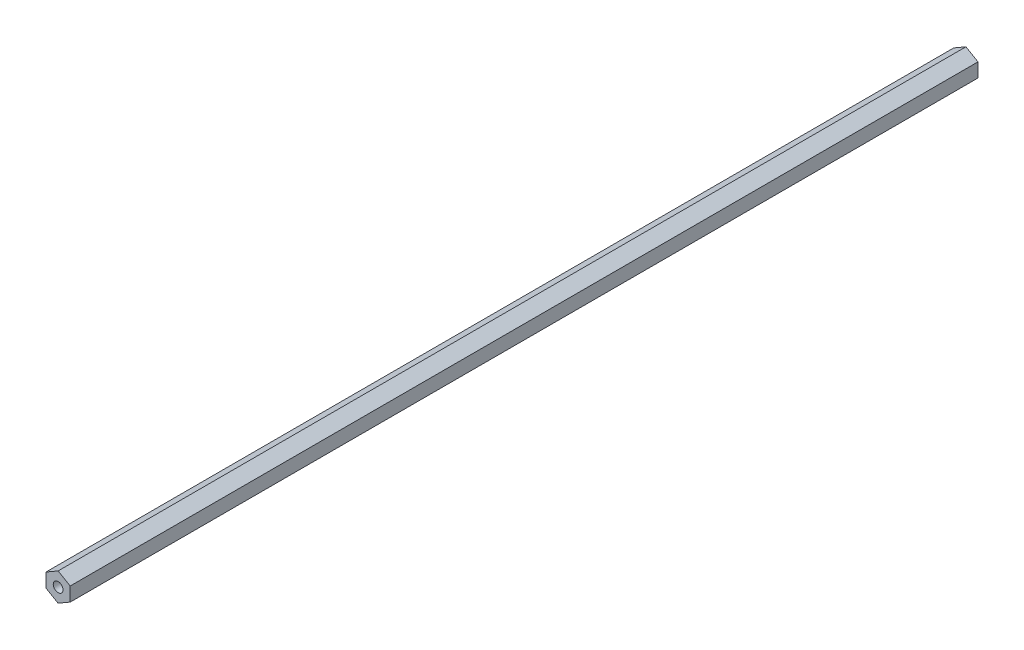
ISO-10303-21;
HEADER;
FILE_DESCRIPTION(('STEP AP214'),'2;1');
FILE_NAME('part.step','',(''),(''),'','','');
FILE_SCHEMA(('AUTOMOTIVE_DESIGN { 1 0 10303 214 1 1 1 1 }'));
ENDSEC;
DATA;
#1=APPLICATION_CONTEXT('core data for automotive mechanical design processes');
#2=APPLICATION_PROTOCOL_DEFINITION('international standard','automotive_design',2000,#1);
#3=PRODUCT_CONTEXT('',#1,'mechanical');
#4=PRODUCT('Part','Part','',(#3));
#5=PRODUCT_RELATED_PRODUCT_CATEGORY('part','',(#4));
#6=PRODUCT_DEFINITION_FORMATION('','',#4);
#7=PRODUCT_DEFINITION_CONTEXT('part definition',#1,'design');
#8=PRODUCT_DEFINITION('design','',#6,#7);
#9=PRODUCT_DEFINITION_SHAPE('','',#8);
#10=(LENGTH_UNIT() NAMED_UNIT(*) SI_UNIT(.MILLI.,.METRE.));
#11=(NAMED_UNIT(*) PLANE_ANGLE_UNIT() SI_UNIT($,.RADIAN.));
#12=(NAMED_UNIT(*) SI_UNIT($,.STERADIAN.) SOLID_ANGLE_UNIT());
#13=UNCERTAINTY_MEASURE_WITH_UNIT(LENGTH_MEASURE(1.E-05),#10,'distance_accuracy_value','');
#14=(GEOMETRIC_REPRESENTATION_CONTEXT(3) GLOBAL_UNCERTAINTY_ASSIGNED_CONTEXT((#13)) GLOBAL_UNIT_ASSIGNED_CONTEXT((#10,
#11,#12)) REPRESENTATION_CONTEXT('',''));
#15=CARTESIAN_POINT('',(0.,0.,0.));
#16=DIRECTION('',(0.,0.,1.));
#17=DIRECTION('',(1.,0.,0.));
#18=AXIS2_PLACEMENT_3D('',#15,#16,#17);
#19=CARTESIAN_POINT('',(-6.35,3.66617420935412,238.125));
#20=DIRECTION('',(0.5,-0.866025403784439,0.));
#21=DIRECTION('',(0.866025403784439,0.5,0.));
#22=AXIS2_PLACEMENT_3D('',#19,#20,#21);
#23=PLANE('',#22);
#24=DIRECTION('',(-0.866025403784439,-0.5,0.));
#25=VECTOR('',#24,1.);
#26=CARTESIAN_POINT('',(-6.35,3.66617420935412,-238.125));
#27=LINE('',#26,#25);
#28=CARTESIAN_POINT('',(0.,7.33234841870825,-238.125));
#29=VERTEX_POINT('',#28);
#30=CARTESIAN_POINT('',(-6.35,3.66617420935412,-238.125));
#31=VERTEX_POINT('',#30);
#32=EDGE_CURVE('E136',#29,#31,#27,.T.);
#33=ORIENTED_EDGE('',*,*,#32,.T.);
#34=DIRECTION('',(0.,0.,-1.));
#35=VECTOR('',#34,1.);
#36=CARTESIAN_POINT('',(-6.35,3.66617420935412,238.125));
#37=LINE('',#36,#35);
#38=CARTESIAN_POINT('',(-6.35,3.66617420935412,238.125));
#39=VERTEX_POINT('',#38);
#40=EDGE_CURVE('E11',#39,#31,#37,.T.);
#41=ORIENTED_EDGE('',*,*,#40,.F.);
#42=DIRECTION('',(-0.866025403784439,-0.5,0.));
#43=VECTOR('',#42,1.);
#44=CARTESIAN_POINT('',(-6.35,3.66617420935412,238.125));
#45=LINE('',#44,#43);
#46=CARTESIAN_POINT('',(0.,7.33234841870825,238.125));
#47=VERTEX_POINT('',#46);
#48=EDGE_CURVE('E153',#47,#39,#45,.T.);
#49=ORIENTED_EDGE('',*,*,#48,.F.);
#50=DIRECTION('',(0.,0.,-1.));
#51=VECTOR('',#50,1.);
#52=CARTESIAN_POINT('',(0.,7.33234841870825,238.125));
#53=LINE('',#52,#51);
#54=EDGE_CURVE('E132',#47,#29,#53,.T.);
#55=ORIENTED_EDGE('',*,*,#54,.T.);
#56=EDGE_LOOP('',(#33,#41,#49,#55));
#57=FACE_BOUND('',#56,.T.);
#58=ADVANCED_FACE('F43',(#57),#23,.F.);
#59=CARTESIAN_POINT('',(-6.35,-3.66617420935412,238.125));
#60=DIRECTION('',(1.,0.,0.));
#61=DIRECTION('',(0.,1.,0.));
#62=AXIS2_PLACEMENT_3D('',#59,#60,#61);
#63=PLANE('',#62);
#64=DIRECTION('',(0.,-1.,0.));
#65=VECTOR('',#64,1.);
#66=CARTESIAN_POINT('',(-6.35,-3.66617420935412,-238.125));
#67=LINE('',#66,#65);
#68=CARTESIAN_POINT('',(-6.35,-3.66617420935412,-238.125));
#69=VERTEX_POINT('',#68);
#70=EDGE_CURVE('E140',#31,#69,#67,.T.);
#71=ORIENTED_EDGE('',*,*,#70,.T.);
#72=DIRECTION('',(0.,0.,-1.));
#73=VECTOR('',#72,1.);
#74=CARTESIAN_POINT('',(-6.35,-3.66617420935412,238.125));
#75=LINE('',#74,#73);
#76=CARTESIAN_POINT('',(-6.35,-3.66617420935412,238.125));
#77=VERTEX_POINT('',#76);
#78=EDGE_CURVE('E52',#77,#69,#75,.T.);
#79=ORIENTED_EDGE('',*,*,#78,.F.);
#80=DIRECTION('',(0.,-1.,0.));
#81=VECTOR('',#80,1.);
#82=CARTESIAN_POINT('',(-6.35,-3.66617420935412,238.125));
#83=LINE('',#82,#81);
#84=EDGE_CURVE('E98',#39,#77,#83,.T.);
#85=ORIENTED_EDGE('',*,*,#84,.F.);
#86=ORIENTED_EDGE('',*,*,#40,.T.);
#87=EDGE_LOOP('',(#71,#79,#85,#86));
#88=FACE_BOUND('',#87,.T.);
#89=ADVANCED_FACE('F183',(#88),#63,.F.);
#90=CARTESIAN_POINT('',(0.,-7.33234841870825,238.125));
#91=DIRECTION('',(0.5,0.866025403784439,0.));
#92=DIRECTION('',(-0.866025403784439,0.5,0.));
#93=AXIS2_PLACEMENT_3D('',#90,#91,#92);
#94=PLANE('',#93);
#95=DIRECTION('',(0.866025403784438,-0.5,0.));
#96=VECTOR('',#95,1.);
#97=CARTESIAN_POINT('',(0.,-7.33234841870825,-238.125));
#98=LINE('',#97,#96);
#99=CARTESIAN_POINT('',(0.,-7.33234841870825,-238.125));
#100=VERTEX_POINT('',#99);
#101=EDGE_CURVE('E144',#69,#100,#98,.T.);
#102=ORIENTED_EDGE('',*,*,#101,.T.);
#103=DIRECTION('',(0.,0.,-1.));
#104=VECTOR('',#103,1.);
#105=CARTESIAN_POINT('',(0.,-7.33234841870825,238.125));
#106=LINE('',#105,#104);
#107=CARTESIAN_POINT('',(0.,-7.33234841870825,238.125));
#108=VERTEX_POINT('',#107);
#109=EDGE_CURVE('E124',#108,#100,#106,.T.);
#110=ORIENTED_EDGE('',*,*,#109,.F.);
#111=DIRECTION('',(0.866025403784438,-0.5,0.));
#112=VECTOR('',#111,1.);
#113=CARTESIAN_POINT('',(0.,-7.33234841870825,238.125));
#114=LINE('',#113,#112);
#115=EDGE_CURVE('E113',#77,#108,#114,.T.);
#116=ORIENTED_EDGE('',*,*,#115,.F.);
#117=ORIENTED_EDGE('',*,*,#78,.T.);
#118=EDGE_LOOP('',(#102,#110,#116,#117));
#119=FACE_BOUND('',#118,.T.);
#120=ADVANCED_FACE('F164',(#119),#94,.F.);
#121=CARTESIAN_POINT('',(6.35,-3.66617420935412,238.125));
#122=DIRECTION('',(-0.5,0.866025403784438,0.));
#123=DIRECTION('',(-0.866025403784439,-0.5,0.));
#124=AXIS2_PLACEMENT_3D('',#121,#122,#123);
#125=PLANE('',#124);
#126=DIRECTION('',(0.866025403784439,0.5,0.));
#127=VECTOR('',#126,1.);
#128=CARTESIAN_POINT('',(6.35,-3.66617420935412,-238.125));
#129=LINE('',#128,#127);
#130=CARTESIAN_POINT('',(6.35,-3.66617420935412,-238.125));
#131=VERTEX_POINT('',#130);
#132=EDGE_CURVE('E122',#100,#131,#129,.T.);
#133=ORIENTED_EDGE('',*,*,#132,.T.);
#134=DIRECTION('',(0.,0.,-1.));
#135=VECTOR('',#134,1.);
#136=CARTESIAN_POINT('',(6.35,-3.66617420935412,238.125));
#137=LINE('',#136,#135);
#138=CARTESIAN_POINT('',(6.35,-3.66617420935412,238.125));
#139=VERTEX_POINT('',#138);
#140=EDGE_CURVE('E119',#139,#131,#137,.T.);
#141=ORIENTED_EDGE('',*,*,#140,.F.);
#142=DIRECTION('',(0.866025403784439,0.5,0.));
#143=VECTOR('',#142,1.);
#144=CARTESIAN_POINT('',(6.35,-3.66617420935412,238.125));
#145=LINE('',#144,#143);
#146=EDGE_CURVE('E107',#108,#139,#145,.T.);
#147=ORIENTED_EDGE('',*,*,#146,.F.);
#148=ORIENTED_EDGE('',*,*,#109,.T.);
#149=EDGE_LOOP('',(#133,#141,#147,#148));
#150=FACE_BOUND('',#149,.T.);
#151=ADVANCED_FACE('F120',(#150),#125,.F.);
#152=CARTESIAN_POINT('',(6.35,3.66617420935412,238.125));
#153=DIRECTION('',(-1.,0.,0.));
#154=DIRECTION('',(0.,-1.,0.));
#155=AXIS2_PLACEMENT_3D('',#152,#153,#154);
#156=PLANE('',#155);
#157=DIRECTION('',(0.,1.,0.));
#158=VECTOR('',#157,1.);
#159=CARTESIAN_POINT('',(6.35,3.66617420935412,-238.125));
#160=LINE('',#159,#158);
#161=CARTESIAN_POINT('',(6.35,3.66617420935412,-238.125));
#162=VERTEX_POINT('',#161);
#163=EDGE_CURVE('E84',#131,#162,#160,.T.);
#164=ORIENTED_EDGE('',*,*,#163,.T.);
#165=DIRECTION('',(0.,0.,-1.));
#166=VECTOR('',#165,1.);
#167=CARTESIAN_POINT('',(6.35,3.66617420935412,238.125));
#168=LINE('',#167,#166);
#169=CARTESIAN_POINT('',(6.35,3.66617420935412,238.125));
#170=VERTEX_POINT('',#169);
#171=EDGE_CURVE('E125',#170,#162,#168,.T.);
#172=ORIENTED_EDGE('',*,*,#171,.F.);
#173=DIRECTION('',(0.,1.,0.));
#174=VECTOR('',#173,1.);
#175=CARTESIAN_POINT('',(6.35,3.66617420935412,238.125));
#176=LINE('',#175,#174);
#177=EDGE_CURVE('E111',#139,#170,#176,.T.);
#178=ORIENTED_EDGE('',*,*,#177,.F.);
#179=ORIENTED_EDGE('',*,*,#140,.T.);
#180=EDGE_LOOP('',(#164,#172,#178,#179));
#181=FACE_BOUND('',#180,.T.);
#182=ADVANCED_FACE('F127',(#181),#156,.F.);
#183=CARTESIAN_POINT('',(0.,7.33234841870825,238.125));
#184=DIRECTION('',(-0.5,-0.866025403784439,0.));
#185=DIRECTION('',(0.866025403784439,-0.5,0.));
#186=AXIS2_PLACEMENT_3D('',#183,#184,#185);
#187=PLANE('',#186);
#188=DIRECTION('',(-0.866025403784439,0.5,0.));
#189=VECTOR('',#188,1.);
#190=CARTESIAN_POINT('',(0.,7.33234841870825,-238.125));
#191=LINE('',#190,#189);
#192=EDGE_CURVE('E90',#162,#29,#191,.T.);
#193=ORIENTED_EDGE('',*,*,#192,.T.);
#194=ORIENTED_EDGE('',*,*,#54,.F.);
#195=DIRECTION('',(-0.866025403784439,0.5,0.));
#196=VECTOR('',#195,1.);
#197=CARTESIAN_POINT('',(0.,7.33234841870825,238.125));
#198=LINE('',#197,#196);
#199=EDGE_CURVE('E60',#170,#47,#198,.T.);
#200=ORIENTED_EDGE('',*,*,#199,.F.);
#201=ORIENTED_EDGE('',*,*,#171,.T.);
#202=EDGE_LOOP('',(#193,#194,#200,#201));
#203=FACE_BOUND('',#202,.T.);
#204=ADVANCED_FACE('F171',(#203),#187,.F.);
#205=CARTESIAN_POINT('',(0.,0.,238.125));
#206=DIRECTION('',(0.,0.,-1.));
#207=DIRECTION('',(-1.,0.,0.));
#208=AXIS2_PLACEMENT_3D('',#205,#206,#207);
#209=PLANE('',#208);
#210=CARTESIAN_POINT('',(0.,0.,238.125));
#211=DIRECTION('',(0.,0.,1.));
#212=DIRECTION('',(1.,0.,0.));
#213=AXIS2_PLACEMENT_3D('',#210,#211,#212);
#214=CIRCLE('',#213,2.5527);
#215=CARTESIAN_POINT('',(2.5527,0.,238.125));
#216=VERTEX_POINT('',#215);
#217=EDGE_CURVE('E312',#216,#216,#214,.T.);
#218=ORIENTED_EDGE('',*,*,#217,.F.);
#219=EDGE_LOOP('',(#218));
#220=FACE_BOUND('',#219,.T.);
#221=ORIENTED_EDGE('',*,*,#48,.T.);
#222=ORIENTED_EDGE('',*,*,#84,.T.);
#223=ORIENTED_EDGE('',*,*,#115,.T.);
#224=ORIENTED_EDGE('',*,*,#146,.T.);
#225=ORIENTED_EDGE('',*,*,#177,.T.);
#226=ORIENTED_EDGE('',*,*,#199,.T.);
#227=EDGE_LOOP('',(#221,#222,#223,#224,#225,#226));
#228=FACE_BOUND('',#227,.T.);
#229=ADVANCED_FACE('F109',(#220,#228),#209,.F.);
#230=CARTESIAN_POINT('',(0.,0.,-238.125));
#231=DIRECTION('',(0.,0.,-1.));
#232=DIRECTION('',(-1.,0.,0.));
#233=AXIS2_PLACEMENT_3D('',#230,#231,#232);
#234=PLANE('',#233);
#235=CARTESIAN_POINT('',(0.,0.,-238.125));
#236=DIRECTION('',(0.,0.,-1.));
#237=DIRECTION('',(-1.,0.,0.));
#238=AXIS2_PLACEMENT_3D('',#235,#236,#237);
#239=CIRCLE('',#238,2.5527);
#240=CARTESIAN_POINT('',(-2.5527,0.,-238.125));
#241=VERTEX_POINT('',#240);
#242=EDGE_CURVE('E307',#241,#241,#239,.T.);
#243=ORIENTED_EDGE('',*,*,#242,.F.);
#244=EDGE_LOOP('',(#243));
#245=FACE_BOUND('',#244,.T.);
#246=ORIENTED_EDGE('',*,*,#32,.F.);
#247=ORIENTED_EDGE('',*,*,#192,.F.);
#248=ORIENTED_EDGE('',*,*,#163,.F.);
#249=ORIENTED_EDGE('',*,*,#132,.F.);
#250=ORIENTED_EDGE('',*,*,#101,.F.);
#251=ORIENTED_EDGE('',*,*,#70,.F.);
#252=EDGE_LOOP('',(#246,#247,#248,#249,#250,#251));
#253=FACE_BOUND('',#252,.T.);
#254=ADVANCED_FACE('F167',(#245,#253),#234,.T.);
#255=CARTESIAN_POINT('',(0.,0.,212.725));
#256=DIRECTION('',(0.,0.,1.));
#257=DIRECTION('',(1.,0.,0.));
#258=AXIS2_PLACEMENT_3D('',#255,#256,#257);
#259=CONICAL_SURFACE('',#258,2.55269999999999,1.02974425867665);
#260=CARTESIAN_POINT('',(0.,0.,211.191183097808));
#261=VERTEX_POINT('',#260);
#262=VERTEX_LOOP('',#261);
#263=FACE_BOUND('',#262,.T.);
#264=CARTESIAN_POINT('',(0.,0.,212.725));
#265=DIRECTION('',(0.,0.,1.));
#266=DIRECTION('',(1.,0.,0.));
#267=AXIS2_PLACEMENT_3D('',#264,#265,#266);
#268=CIRCLE('',#267,2.55269999999999);
#269=CARTESIAN_POINT('',(2.55269999999999,0.,212.725));
#270=VERTEX_POINT('',#269);
#271=EDGE_CURVE('E141',#270,#270,#268,.T.);
#272=ORIENTED_EDGE('',*,*,#271,.T.);
#273=EDGE_LOOP('',(#272));
#274=FACE_BOUND('',#273,.T.);
#275=ADVANCED_FACE('F221',(#263,#274),#259,.F.);
#276=CARTESIAN_POINT('',(0.,0.,238.125));
#277=DIRECTION('',(0.,0.,1.));
#278=DIRECTION('',(1.,0.,0.));
#279=AXIS2_PLACEMENT_3D('',#276,#277,#278);
#280=CYLINDRICAL_SURFACE('',#279,2.5527);
#281=ORIENTED_EDGE('',*,*,#271,.F.);
#282=EDGE_LOOP('',(#281));
#283=FACE_BOUND('',#282,.T.);
#284=ORIENTED_EDGE('',*,*,#217,.T.);
#285=EDGE_LOOP('',(#284));
#286=FACE_BOUND('',#285,.T.);
#287=ADVANCED_FACE('F226',(#283,#286),#280,.F.);
#288=CARTESIAN_POINT('',(0.,0.,-212.725));
#289=DIRECTION('',(0.,0.,-1.));
#290=DIRECTION('',(-1.,0.,0.));
#291=AXIS2_PLACEMENT_3D('',#288,#289,#290);
#292=CONICAL_SURFACE('',#291,2.55269999999999,1.02974425867665);
#293=CARTESIAN_POINT('',(0.,0.,-211.191183097808));
#294=VERTEX_POINT('',#293);
#295=VERTEX_LOOP('',#294);
#296=FACE_BOUND('',#295,.T.);
#297=CARTESIAN_POINT('',(0.,0.,-212.725));
#298=DIRECTION('',(0.,0.,-1.));
#299=DIRECTION('',(-1.,0.,0.));
#300=AXIS2_PLACEMENT_3D('',#297,#298,#299);
#301=CIRCLE('',#300,2.55269999999999);
#302=CARTESIAN_POINT('',(-2.55269999999999,0.,-212.725));
#303=VERTEX_POINT('',#302);
#304=EDGE_CURVE('E304',#303,#303,#301,.T.);
#305=ORIENTED_EDGE('',*,*,#304,.T.);
#306=EDGE_LOOP('',(#305));
#307=FACE_BOUND('',#306,.T.);
#308=ADVANCED_FACE('F237',(#296,#307),#292,.F.);
#309=CARTESIAN_POINT('',(0.,0.,-238.125));
#310=DIRECTION('',(0.,0.,-1.));
#311=DIRECTION('',(-1.,0.,0.));
#312=AXIS2_PLACEMENT_3D('',#309,#310,#311);
#313=CYLINDRICAL_SURFACE('',#312,2.5527);
#314=ORIENTED_EDGE('',*,*,#304,.F.);
#315=EDGE_LOOP('',(#314));
#316=FACE_BOUND('',#315,.T.);
#317=ORIENTED_EDGE('',*,*,#242,.T.);
#318=EDGE_LOOP('',(#317));
#319=FACE_BOUND('',#318,.T.);
#320=ADVANCED_FACE('F255',(#316,#319),#313,.F.);
#321=CLOSED_SHELL('',(#58,#89,#120,#151,#182,#204,#229,#254,#275,#287,#308,#320));
#322=MANIFOLD_SOLID_BREP('B2',#321);
#323=ADVANCED_BREP_SHAPE_REPRESENTATION('',(#18,#322),#14);
#324=SHAPE_DEFINITION_REPRESENTATION(#9,#323);
ENDSEC;
END-ISO-10303-21;
